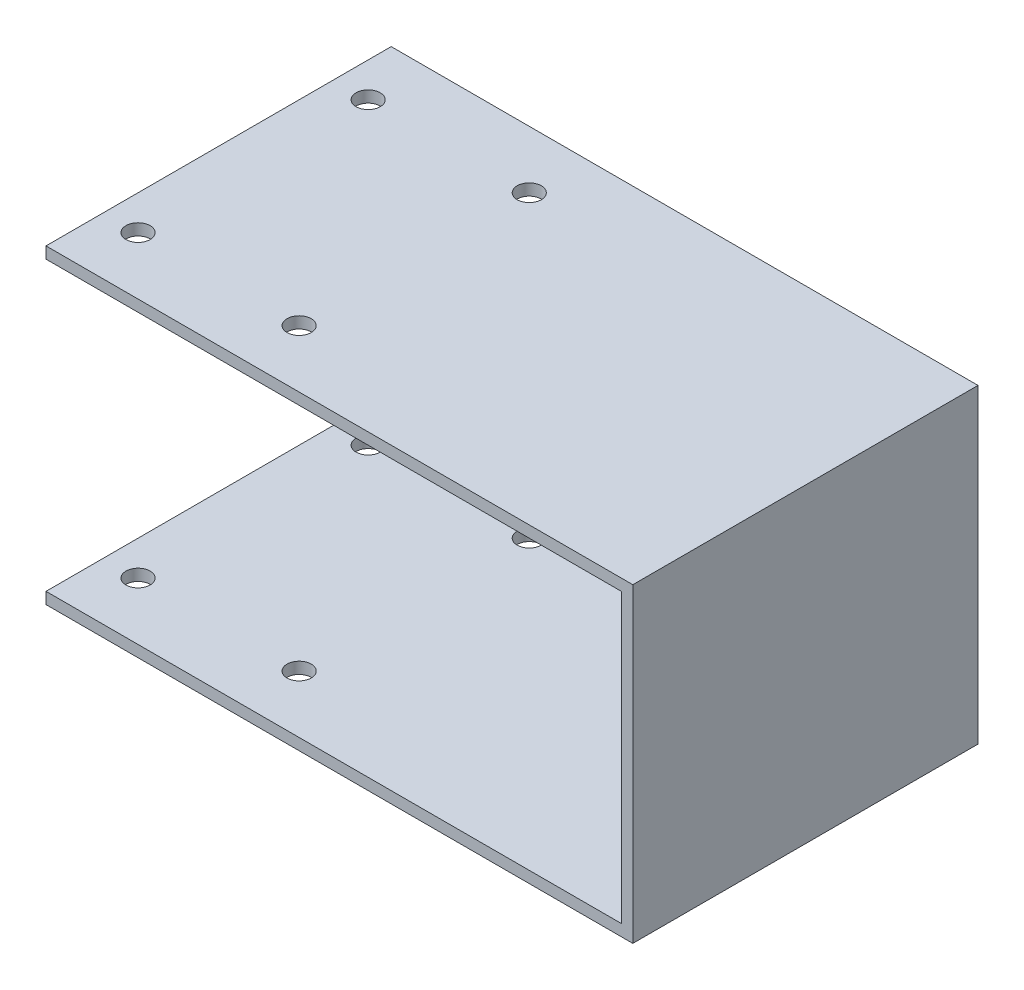
ISO-10303-21;
HEADER;
FILE_DESCRIPTION(('STEP AP214'),'2;1');
FILE_NAME('part.step','',(''),(''),'','','');
FILE_SCHEMA(('AUTOMOTIVE_DESIGN { 1 0 10303 214 1 1 1 1 }'));
ENDSEC;
DATA;
#1=APPLICATION_CONTEXT('core data for automotive mechanical design processes');
#2=APPLICATION_PROTOCOL_DEFINITION('international standard','automotive_design',2000,#1);
#3=PRODUCT_CONTEXT('',#1,'mechanical');
#4=PRODUCT('Part','Part','',(#3));
#5=PRODUCT_RELATED_PRODUCT_CATEGORY('part','',(#4));
#6=PRODUCT_DEFINITION_FORMATION('','',#4);
#7=PRODUCT_DEFINITION_CONTEXT('part definition',#1,'design');
#8=PRODUCT_DEFINITION('design','',#6,#7);
#9=PRODUCT_DEFINITION_SHAPE('','',#8);
#10=(LENGTH_UNIT() NAMED_UNIT(*) SI_UNIT(.MILLI.,.METRE.));
#11=(NAMED_UNIT(*) PLANE_ANGLE_UNIT() SI_UNIT($,.RADIAN.));
#12=(NAMED_UNIT(*) SI_UNIT($,.STERADIAN.) SOLID_ANGLE_UNIT());
#13=UNCERTAINTY_MEASURE_WITH_UNIT(LENGTH_MEASURE(1.E-05),#10,'distance_accuracy_value','');
#14=(GEOMETRIC_REPRESENTATION_CONTEXT(3) GLOBAL_UNCERTAINTY_ASSIGNED_CONTEXT((#13)) GLOBAL_UNIT_ASSIGNED_CONTEXT((#10,
#11,#12)) REPRESENTATION_CONTEXT('',''));
#15=CARTESIAN_POINT('',(0.,0.,0.));
#16=DIRECTION('',(0.,0.,1.));
#17=DIRECTION('',(1.,0.,0.));
#18=AXIS2_PLACEMENT_3D('',#15,#16,#17);
#19=CARTESIAN_POINT('',(0.,-52.,60.));
#20=DIRECTION('',(-1.,0.,0.));
#21=DIRECTION('',(0.,0.,1.));
#22=AXIS2_PLACEMENT_3D('',#19,#20,#21);
#23=PLANE('',#22);
#24=DIRECTION('',(0.,1.,0.));
#25=VECTOR('',#24,1.);
#26=CARTESIAN_POINT('',(0.,-52.,0.));
#27=LINE('',#26,#25);
#28=CARTESIAN_POINT('',(0.,-52.,0.));
#29=VERTEX_POINT('',#28);
#30=CARTESIAN_POINT('',(0.,-50.,0.));
#31=VERTEX_POINT('',#30);
#32=EDGE_CURVE('E141',#29,#31,#27,.T.);
#33=ORIENTED_EDGE('',*,*,#32,.F.);
#34=DIRECTION('',(0.,0.,-1.));
#35=VECTOR('',#34,1.);
#36=CARTESIAN_POINT('',(0.,-52.,60.));
#37=LINE('',#36,#35);
#38=CARTESIAN_POINT('',(0.,-52.,60.));
#39=VERTEX_POINT('',#38);
#40=EDGE_CURVE('E11',#39,#29,#37,.T.);
#41=ORIENTED_EDGE('',*,*,#40,.F.);
#42=DIRECTION('',(0.,1.,0.));
#43=VECTOR('',#42,1.);
#44=CARTESIAN_POINT('',(0.,-52.,60.));
#45=LINE('',#44,#43);
#46=CARTESIAN_POINT('',(0.,-50.,60.));
#47=VERTEX_POINT('',#46);
#48=EDGE_CURVE('E162',#39,#47,#45,.T.);
#49=ORIENTED_EDGE('',*,*,#48,.T.);
#50=DIRECTION('',(0.,0.,-1.));
#51=VECTOR('',#50,1.);
#52=CARTESIAN_POINT('',(0.,-50.,60.));
#53=LINE('',#52,#51);
#54=EDGE_CURVE('E99',#47,#31,#53,.T.);
#55=ORIENTED_EDGE('',*,*,#54,.T.);
#56=EDGE_LOOP('',(#33,#41,#49,#55));
#57=FACE_BOUND('',#56,.T.);
#58=ADVANCED_FACE('F43',(#57),#23,.T.);
#59=CARTESIAN_POINT('',(102.,-52.,60.));
#60=DIRECTION('',(0.,-1.,0.));
#61=DIRECTION('',(1.,0.,0.));
#62=AXIS2_PLACEMENT_3D('',#59,#60,#61);
#63=PLANE('',#62);
#64=CARTESIAN_POINT('',(6.00000000000001,-52.,50.));
#65=DIRECTION('',(0.,1.,0.));
#66=DIRECTION('',(0.,0.,1.));
#67=AXIS2_PLACEMENT_3D('',#64,#65,#66);
#68=CIRCLE('',#67,2.1);
#69=CARTESIAN_POINT('',(6.00000000000001,-52.,52.1));
#70=VERTEX_POINT('',#69);
#71=EDGE_CURVE('E267',#70,#70,#68,.T.);
#72=ORIENTED_EDGE('',*,*,#71,.T.);
#73=EDGE_LOOP('',(#72));
#74=FACE_BOUND('',#73,.T.);
#75=CARTESIAN_POINT('',(34.,-52.,50.));
#76=DIRECTION('',(0.,1.,0.));
#77=DIRECTION('',(0.,0.,1.));
#78=AXIS2_PLACEMENT_3D('',#75,#76,#77);
#79=CIRCLE('',#78,2.1);
#80=CARTESIAN_POINT('',(34.,-52.,52.1));
#81=VERTEX_POINT('',#80);
#82=EDGE_CURVE('E273',#81,#81,#79,.T.);
#83=ORIENTED_EDGE('',*,*,#82,.T.);
#84=EDGE_LOOP('',(#83));
#85=FACE_BOUND('',#84,.T.);
#86=CARTESIAN_POINT('',(34.,-52.,10.));
#87=DIRECTION('',(0.,1.,0.));
#88=DIRECTION('',(0.,0.,1.));
#89=AXIS2_PLACEMENT_3D('',#86,#87,#88);
#90=CIRCLE('',#89,2.1);
#91=CARTESIAN_POINT('',(34.,-52.,12.1));
#92=VERTEX_POINT('',#91);
#93=EDGE_CURVE('E260',#92,#92,#90,.T.);
#94=ORIENTED_EDGE('',*,*,#93,.T.);
#95=EDGE_LOOP('',(#94));
#96=FACE_BOUND('',#95,.T.);
#97=CARTESIAN_POINT('',(6.,-52.,9.99999999999999));
#98=DIRECTION('',(0.,1.,0.));
#99=DIRECTION('',(0.,0.,1.));
#100=AXIS2_PLACEMENT_3D('',#97,#98,#99);
#101=CIRCLE('',#100,2.1);
#102=CARTESIAN_POINT('',(6.,-52.,12.1));
#103=VERTEX_POINT('',#102);
#104=EDGE_CURVE('E258',#103,#103,#101,.T.);
#105=ORIENTED_EDGE('',*,*,#104,.T.);
#106=EDGE_LOOP('',(#105));
#107=FACE_BOUND('',#106,.T.);
#108=DIRECTION('',(-1.,0.,0.));
#109=VECTOR('',#108,1.);
#110=CARTESIAN_POINT('',(102.,-52.,0.));
#111=LINE('',#110,#109);
#112=CARTESIAN_POINT('',(102.,-52.,0.));
#113=VERTEX_POINT('',#112);
#114=EDGE_CURVE('E160',#113,#29,#111,.T.);
#115=ORIENTED_EDGE('',*,*,#114,.F.);
#116=DIRECTION('',(0.,0.,-1.));
#117=VECTOR('',#116,1.);
#118=CARTESIAN_POINT('',(102.,-52.,60.));
#119=LINE('',#118,#117);
#120=CARTESIAN_POINT('',(102.,-52.,60.));
#121=VERTEX_POINT('',#120);
#122=EDGE_CURVE('E52',#121,#113,#119,.T.);
#123=ORIENTED_EDGE('',*,*,#122,.F.);
#124=DIRECTION('',(-1.,0.,0.));
#125=VECTOR('',#124,1.);
#126=CARTESIAN_POINT('',(102.,-52.,60.));
#127=LINE('',#126,#125);
#128=EDGE_CURVE('E131',#121,#39,#127,.T.);
#129=ORIENTED_EDGE('',*,*,#128,.T.);
#130=ORIENTED_EDGE('',*,*,#40,.T.);
#131=EDGE_LOOP('',(#115,#123,#129,#130));
#132=FACE_BOUND('',#131,.T.);
#133=ADVANCED_FACE('F215',(#74,#85,#96,#107,#132),#63,.T.);
#134=CARTESIAN_POINT('',(102.,2.,60.));
#135=DIRECTION('',(1.,0.,0.));
#136=DIRECTION('',(0.,0.,-1.));
#137=AXIS2_PLACEMENT_3D('',#134,#135,#136);
#138=PLANE('',#137);
#139=DIRECTION('',(0.,-1.,0.));
#140=VECTOR('',#139,1.);
#141=CARTESIAN_POINT('',(102.,2.,0.));
#142=LINE('',#141,#140);
#143=CARTESIAN_POINT('',(102.,2.,0.));
#144=VERTEX_POINT('',#143);
#145=EDGE_CURVE('E118',#144,#113,#142,.T.);
#146=ORIENTED_EDGE('',*,*,#145,.F.);
#147=DIRECTION('',(0.,0.,-1.));
#148=VECTOR('',#147,1.);
#149=CARTESIAN_POINT('',(102.,2.,60.));
#150=LINE('',#149,#148);
#151=CARTESIAN_POINT('',(102.,2.,60.));
#152=VERTEX_POINT('',#151);
#153=EDGE_CURVE('E113',#152,#144,#150,.T.);
#154=ORIENTED_EDGE('',*,*,#153,.F.);
#155=DIRECTION('',(0.,-1.,0.));
#156=VECTOR('',#155,1.);
#157=CARTESIAN_POINT('',(102.,2.,60.));
#158=LINE('',#157,#156);
#159=EDGE_CURVE('E116',#152,#121,#158,.T.);
#160=ORIENTED_EDGE('',*,*,#159,.T.);
#161=ORIENTED_EDGE('',*,*,#122,.T.);
#162=EDGE_LOOP('',(#146,#154,#160,#161));
#163=FACE_BOUND('',#162,.T.);
#164=ADVANCED_FACE('F115',(#163),#138,.T.);
#165=CARTESIAN_POINT('',(0.,2.,60.));
#166=DIRECTION('',(0.,1.,0.));
#167=DIRECTION('',(0.,0.,1.));
#168=AXIS2_PLACEMENT_3D('',#165,#166,#167);
#169=PLANE('',#168);
#170=CARTESIAN_POINT('',(6.00000000000001,2.,50.));
#171=DIRECTION('',(0.,1.,0.));
#172=DIRECTION('',(0.,0.,1.));
#173=AXIS2_PLACEMENT_3D('',#170,#171,#172);
#174=CIRCLE('',#173,2.1);
#175=CARTESIAN_POINT('',(6.00000000000001,2.,52.1));
#176=VERTEX_POINT('',#175);
#177=EDGE_CURVE('E270',#176,#176,#174,.T.);
#178=ORIENTED_EDGE('',*,*,#177,.F.);
#179=EDGE_LOOP('',(#178));
#180=FACE_BOUND('',#179,.T.);
#181=CARTESIAN_POINT('',(34.,2.,50.));
#182=DIRECTION('',(0.,1.,0.));
#183=DIRECTION('',(0.,0.,1.));
#184=AXIS2_PLACEMENT_3D('',#181,#182,#183);
#185=CIRCLE('',#184,2.1);
#186=CARTESIAN_POINT('',(34.,2.,52.1));
#187=VERTEX_POINT('',#186);
#188=EDGE_CURVE('E269',#187,#187,#185,.T.);
#189=ORIENTED_EDGE('',*,*,#188,.F.);
#190=EDGE_LOOP('',(#189));
#191=FACE_BOUND('',#190,.T.);
#192=CARTESIAN_POINT('',(34.,2.,10.));
#193=DIRECTION('',(0.,1.,0.));
#194=DIRECTION('',(0.,0.,1.));
#195=AXIS2_PLACEMENT_3D('',#192,#193,#194);
#196=CIRCLE('',#195,2.1);
#197=CARTESIAN_POINT('',(34.,2.,12.1));
#198=VERTEX_POINT('',#197);
#199=EDGE_CURVE('E264',#198,#198,#196,.T.);
#200=ORIENTED_EDGE('',*,*,#199,.F.);
#201=EDGE_LOOP('',(#200));
#202=FACE_BOUND('',#201,.T.);
#203=CARTESIAN_POINT('',(6.,2.,9.99999999999999));
#204=DIRECTION('',(0.,1.,0.));
#205=DIRECTION('',(0.,0.,1.));
#206=AXIS2_PLACEMENT_3D('',#203,#204,#205);
#207=CIRCLE('',#206,2.1);
#208=CARTESIAN_POINT('',(6.,2.,12.1));
#209=VERTEX_POINT('',#208);
#210=EDGE_CURVE('E177',#209,#209,#207,.T.);
#211=ORIENTED_EDGE('',*,*,#210,.F.);
#212=EDGE_LOOP('',(#211));
#213=FACE_BOUND('',#212,.T.);
#214=DIRECTION('',(1.,0.,0.));
#215=VECTOR('',#214,1.);
#216=CARTESIAN_POINT('',(0.,2.,0.));
#217=LINE('',#216,#215);
#218=CARTESIAN_POINT('',(0.,2.,0.));
#219=VERTEX_POINT('',#218);
#220=EDGE_CURVE('E157',#219,#144,#217,.T.);
#221=ORIENTED_EDGE('',*,*,#220,.F.);
#222=DIRECTION('',(0.,0.,-1.));
#223=VECTOR('',#222,1.);
#224=CARTESIAN_POINT('',(0.,2.,60.));
#225=LINE('',#224,#223);
#226=CARTESIAN_POINT('',(0.,2.,60.));
#227=VERTEX_POINT('',#226);
#228=EDGE_CURVE('E123',#227,#219,#225,.T.);
#229=ORIENTED_EDGE('',*,*,#228,.F.);
#230=DIRECTION('',(1.,0.,0.));
#231=VECTOR('',#230,1.);
#232=CARTESIAN_POINT('',(0.,2.,60.));
#233=LINE('',#232,#231);
#234=EDGE_CURVE('E129',#227,#152,#233,.T.);
#235=ORIENTED_EDGE('',*,*,#234,.T.);
#236=ORIENTED_EDGE('',*,*,#153,.T.);
#237=EDGE_LOOP('',(#221,#229,#235,#236));
#238=FACE_BOUND('',#237,.T.);
#239=ADVANCED_FACE('F133',(#180,#191,#202,#213,#238),#169,.T.);
#240=CARTESIAN_POINT('',(0.,0.,60.));
#241=DIRECTION('',(-1.,0.,0.));
#242=DIRECTION('',(0.,0.,1.));
#243=AXIS2_PLACEMENT_3D('',#240,#241,#242);
#244=PLANE('',#243);
#245=DIRECTION('',(0.,1.,0.));
#246=VECTOR('',#245,1.);
#247=CARTESIAN_POINT('',(0.,0.,0.));
#248=LINE('',#247,#246);
#249=CARTESIAN_POINT('',(0.,0.,0.));
#250=VERTEX_POINT('',#249);
#251=EDGE_CURVE('E154',#250,#219,#248,.T.);
#252=ORIENTED_EDGE('',*,*,#251,.F.);
#253=DIRECTION('',(0.,0.,-1.));
#254=VECTOR('',#253,1.);
#255=CARTESIAN_POINT('',(0.,0.,60.));
#256=LINE('',#255,#254);
#257=CARTESIAN_POINT('',(0.,0.,60.));
#258=VERTEX_POINT('',#257);
#259=EDGE_CURVE('E166',#258,#250,#256,.T.);
#260=ORIENTED_EDGE('',*,*,#259,.F.);
#261=DIRECTION('',(0.,1.,0.));
#262=VECTOR('',#261,1.);
#263=CARTESIAN_POINT('',(0.,0.,60.));
#264=LINE('',#263,#262);
#265=EDGE_CURVE('E134',#258,#227,#264,.T.);
#266=ORIENTED_EDGE('',*,*,#265,.T.);
#267=ORIENTED_EDGE('',*,*,#228,.T.);
#268=EDGE_LOOP('',(#252,#260,#266,#267));
#269=FACE_BOUND('',#268,.T.);
#270=ADVANCED_FACE('F230',(#269),#244,.T.);
#271=CARTESIAN_POINT('',(100.,0.,60.));
#272=DIRECTION('',(0.,-1.,0.));
#273=DIRECTION('',(1.,0.,0.));
#274=AXIS2_PLACEMENT_3D('',#271,#272,#273);
#275=PLANE('',#274);
#276=CARTESIAN_POINT('',(6.00000000000001,0.,50.));
#277=DIRECTION('',(0.,-1.,0.));
#278=DIRECTION('',(1.,0.,0.));
#279=AXIS2_PLACEMENT_3D('',#276,#277,#278);
#280=CIRCLE('',#279,2.1);
#281=CARTESIAN_POINT('',(8.1,0.,50.));
#282=VERTEX_POINT('',#281);
#283=EDGE_CURVE('E145',#282,#282,#280,.F.);
#284=ORIENTED_EDGE('',*,*,#283,.T.);
#285=EDGE_LOOP('',(#284));
#286=FACE_BOUND('',#285,.T.);
#287=CARTESIAN_POINT('',(34.,0.,50.));
#288=DIRECTION('',(0.,-1.,0.));
#289=DIRECTION('',(1.,0.,0.));
#290=AXIS2_PLACEMENT_3D('',#287,#288,#289);
#291=CIRCLE('',#290,2.1);
#292=CARTESIAN_POINT('',(36.1,0.,50.));
#293=VERTEX_POINT('',#292);
#294=EDGE_CURVE('E183',#293,#293,#291,.F.);
#295=ORIENTED_EDGE('',*,*,#294,.T.);
#296=EDGE_LOOP('',(#295));
#297=FACE_BOUND('',#296,.T.);
#298=CARTESIAN_POINT('',(34.,0.,10.));
#299=DIRECTION('',(0.,-1.,0.));
#300=DIRECTION('',(1.,0.,0.));
#301=AXIS2_PLACEMENT_3D('',#298,#299,#300);
#302=CIRCLE('',#301,2.1);
#303=CARTESIAN_POINT('',(36.1,0.,10.));
#304=VERTEX_POINT('',#303);
#305=EDGE_CURVE('E180',#304,#304,#302,.F.);
#306=ORIENTED_EDGE('',*,*,#305,.T.);
#307=EDGE_LOOP('',(#306));
#308=FACE_BOUND('',#307,.T.);
#309=CARTESIAN_POINT('',(6.,0.,9.99999999999999));
#310=DIRECTION('',(0.,-1.,0.));
#311=DIRECTION('',(1.,0.,0.));
#312=AXIS2_PLACEMENT_3D('',#309,#310,#311);
#313=CIRCLE('',#312,2.1);
#314=CARTESIAN_POINT('',(8.1,0.,9.99999999999999));
#315=VERTEX_POINT('',#314);
#316=EDGE_CURVE('E176',#315,#315,#313,.F.);
#317=ORIENTED_EDGE('',*,*,#316,.T.);
#318=EDGE_LOOP('',(#317));
#319=FACE_BOUND('',#318,.T.);
#320=DIRECTION('',(-1.,0.,0.));
#321=VECTOR('',#320,1.);
#322=CARTESIAN_POINT('',(100.,0.,0.));
#323=LINE('',#322,#321);
#324=CARTESIAN_POINT('',(100.,0.,0.));
#325=VERTEX_POINT('',#324);
#326=EDGE_CURVE('E151',#325,#250,#323,.T.);
#327=ORIENTED_EDGE('',*,*,#326,.F.);
#328=DIRECTION('',(0.,0.,-1.));
#329=VECTOR('',#328,1.);
#330=CARTESIAN_POINT('',(100.,0.,60.));
#331=LINE('',#330,#329);
#332=CARTESIAN_POINT('',(100.,0.,60.));
#333=VERTEX_POINT('',#332);
#334=EDGE_CURVE('E168',#333,#325,#331,.T.);
#335=ORIENTED_EDGE('',*,*,#334,.F.);
#336=DIRECTION('',(-1.,0.,0.));
#337=VECTOR('',#336,1.);
#338=CARTESIAN_POINT('',(100.,0.,60.));
#339=LINE('',#338,#337);
#340=EDGE_CURVE('E136',#333,#258,#339,.T.);
#341=ORIENTED_EDGE('',*,*,#340,.T.);
#342=ORIENTED_EDGE('',*,*,#259,.T.);
#343=EDGE_LOOP('',(#327,#335,#341,#342));
#344=FACE_BOUND('',#343,.T.);
#345=ADVANCED_FACE('F206',(#286,#297,#308,#319,#344),#275,.T.);
#346=CARTESIAN_POINT('',(100.,-50.,60.));
#347=DIRECTION('',(-1.,0.,0.));
#348=DIRECTION('',(0.,0.,1.));
#349=AXIS2_PLACEMENT_3D('',#346,#347,#348);
#350=PLANE('',#349);
#351=DIRECTION('',(0.,1.,0.));
#352=VECTOR('',#351,1.);
#353=CARTESIAN_POINT('',(100.,-50.,0.));
#354=LINE('',#353,#352);
#355=CARTESIAN_POINT('',(100.,-50.,0.));
#356=VERTEX_POINT('',#355);
#357=EDGE_CURVE('E148',#356,#325,#354,.T.);
#358=ORIENTED_EDGE('',*,*,#357,.F.);
#359=DIRECTION('',(0.,0.,-1.));
#360=VECTOR('',#359,1.);
#361=CARTESIAN_POINT('',(100.,-50.,60.));
#362=LINE('',#361,#360);
#363=CARTESIAN_POINT('',(100.,-50.,60.));
#364=VERTEX_POINT('',#363);
#365=EDGE_CURVE('E170',#364,#356,#362,.T.);
#366=ORIENTED_EDGE('',*,*,#365,.F.);
#367=DIRECTION('',(0.,1.,0.));
#368=VECTOR('',#367,1.);
#369=CARTESIAN_POINT('',(100.,-50.,60.));
#370=LINE('',#369,#368);
#371=EDGE_CURVE('E200',#364,#333,#370,.T.);
#372=ORIENTED_EDGE('',*,*,#371,.T.);
#373=ORIENTED_EDGE('',*,*,#334,.T.);
#374=EDGE_LOOP('',(#358,#366,#372,#373));
#375=FACE_BOUND('',#374,.T.);
#376=ADVANCED_FACE('F211',(#375),#350,.T.);
#377=CARTESIAN_POINT('',(0.,-50.,60.));
#378=DIRECTION('',(0.,1.,0.));
#379=DIRECTION('',(0.,0.,1.));
#380=AXIS2_PLACEMENT_3D('',#377,#378,#379);
#381=PLANE('',#380);
#382=CARTESIAN_POINT('',(6.00000000000001,-50.,50.));
#383=DIRECTION('',(0.,1.,0.));
#384=DIRECTION('',(0.,0.,1.));
#385=AXIS2_PLACEMENT_3D('',#382,#383,#384);
#386=CIRCLE('',#385,2.1);
#387=CARTESIAN_POINT('',(6.00000000000001,-50.,52.1));
#388=VERTEX_POINT('',#387);
#389=EDGE_CURVE('E46',#388,#388,#386,.F.);
#390=ORIENTED_EDGE('',*,*,#389,.T.);
#391=EDGE_LOOP('',(#390));
#392=FACE_BOUND('',#391,.T.);
#393=CARTESIAN_POINT('',(34.,-50.,50.));
#394=DIRECTION('',(0.,1.,0.));
#395=DIRECTION('',(0.,0.,1.));
#396=AXIS2_PLACEMENT_3D('',#393,#394,#395);
#397=CIRCLE('',#396,2.1);
#398=CARTESIAN_POINT('',(34.,-50.,52.1));
#399=VERTEX_POINT('',#398);
#400=EDGE_CURVE('E181',#399,#399,#397,.F.);
#401=ORIENTED_EDGE('',*,*,#400,.T.);
#402=EDGE_LOOP('',(#401));
#403=FACE_BOUND('',#402,.T.);
#404=CARTESIAN_POINT('',(34.,-50.,10.));
#405=DIRECTION('',(0.,1.,0.));
#406=DIRECTION('',(0.,0.,1.));
#407=AXIS2_PLACEMENT_3D('',#404,#405,#406);
#408=CIRCLE('',#407,2.1);
#409=CARTESIAN_POINT('',(34.,-50.,12.1));
#410=VERTEX_POINT('',#409);
#411=EDGE_CURVE('E178',#410,#410,#408,.F.);
#412=ORIENTED_EDGE('',*,*,#411,.T.);
#413=EDGE_LOOP('',(#412));
#414=FACE_BOUND('',#413,.T.);
#415=CARTESIAN_POINT('',(6.,-50.,9.99999999999999));
#416=DIRECTION('',(0.,1.,0.));
#417=DIRECTION('',(0.,0.,1.));
#418=AXIS2_PLACEMENT_3D('',#415,#416,#417);
#419=CIRCLE('',#418,2.1);
#420=CARTESIAN_POINT('',(6.,-50.,12.1));
#421=VERTEX_POINT('',#420);
#422=EDGE_CURVE('E173',#421,#421,#419,.F.);
#423=ORIENTED_EDGE('',*,*,#422,.T.);
#424=EDGE_LOOP('',(#423));
#425=FACE_BOUND('',#424,.T.);
#426=DIRECTION('',(1.,0.,0.));
#427=VECTOR('',#426,1.);
#428=CARTESIAN_POINT('',(0.,-50.,0.));
#429=LINE('',#428,#427);
#430=EDGE_CURVE('E144',#31,#356,#429,.T.);
#431=ORIENTED_EDGE('',*,*,#430,.F.);
#432=ORIENTED_EDGE('',*,*,#54,.F.);
#433=DIRECTION('',(1.,0.,0.));
#434=VECTOR('',#433,1.);
#435=CARTESIAN_POINT('',(0.,-50.,60.));
#436=LINE('',#435,#434);
#437=EDGE_CURVE('E198',#47,#364,#436,.T.);
#438=ORIENTED_EDGE('',*,*,#437,.T.);
#439=ORIENTED_EDGE('',*,*,#365,.T.);
#440=EDGE_LOOP('',(#431,#432,#438,#439));
#441=FACE_BOUND('',#440,.T.);
#442=ADVANCED_FACE('F212',(#392,#403,#414,#425,#441),#381,.T.);
#443=CARTESIAN_POINT('',(0.,0.,60.));
#444=DIRECTION('',(0.,0.,-1.));
#445=DIRECTION('',(-1.,0.,0.));
#446=AXIS2_PLACEMENT_3D('',#443,#444,#445);
#447=PLANE('',#446);
#448=ORIENTED_EDGE('',*,*,#48,.F.);
#449=ORIENTED_EDGE('',*,*,#128,.F.);
#450=ORIENTED_EDGE('',*,*,#159,.F.);
#451=ORIENTED_EDGE('',*,*,#234,.F.);
#452=ORIENTED_EDGE('',*,*,#265,.F.);
#453=ORIENTED_EDGE('',*,*,#340,.F.);
#454=ORIENTED_EDGE('',*,*,#371,.F.);
#455=ORIENTED_EDGE('',*,*,#437,.F.);
#456=EDGE_LOOP('',(#448,#449,#450,#451,#452,#453,#454,#455));
#457=FACE_BOUND('',#456,.T.);
#458=ADVANCED_FACE('F127',(#457),#447,.F.);
#459=CARTESIAN_POINT('',(0.,0.,0.));
#460=DIRECTION('',(0.,0.,-1.));
#461=DIRECTION('',(-1.,0.,0.));
#462=AXIS2_PLACEMENT_3D('',#459,#460,#461);
#463=PLANE('',#462);
#464=ORIENTED_EDGE('',*,*,#32,.T.);
#465=ORIENTED_EDGE('',*,*,#430,.T.);
#466=ORIENTED_EDGE('',*,*,#357,.T.);
#467=ORIENTED_EDGE('',*,*,#326,.T.);
#468=ORIENTED_EDGE('',*,*,#251,.T.);
#469=ORIENTED_EDGE('',*,*,#220,.T.);
#470=ORIENTED_EDGE('',*,*,#145,.T.);
#471=ORIENTED_EDGE('',*,*,#114,.T.);
#472=EDGE_LOOP('',(#464,#465,#466,#467,#468,#469,#470,#471));
#473=FACE_BOUND('',#472,.T.);
#474=ADVANCED_FACE('F214',(#473),#463,.T.);
#475=CARTESIAN_POINT('',(6.,2.,9.99999999999999));
#476=DIRECTION('',(0.,-1.,0.));
#477=DIRECTION('',(0.,0.,-1.));
#478=AXIS2_PLACEMENT_3D('',#475,#476,#477);
#479=CYLINDRICAL_SURFACE('',#478,2.1);
#480=ORIENTED_EDGE('',*,*,#422,.F.);
#481=EDGE_LOOP('',(#480));
#482=FACE_BOUND('',#481,.T.);
#483=ORIENTED_EDGE('',*,*,#104,.F.);
#484=EDGE_LOOP('',(#483));
#485=FACE_BOUND('',#484,.T.);
#486=ADVANCED_FACE('F250',(#482,#485),#479,.F.);
#487=CARTESIAN_POINT('',(34.,2.,10.));
#488=DIRECTION('',(0.,-1.,0.));
#489=DIRECTION('',(0.,0.,-1.));
#490=AXIS2_PLACEMENT_3D('',#487,#488,#489);
#491=CYLINDRICAL_SURFACE('',#490,2.1);
#492=ORIENTED_EDGE('',*,*,#411,.F.);
#493=EDGE_LOOP('',(#492));
#494=FACE_BOUND('',#493,.T.);
#495=ORIENTED_EDGE('',*,*,#93,.F.);
#496=EDGE_LOOP('',(#495));
#497=FACE_BOUND('',#496,.T.);
#498=ADVANCED_FACE('F253',(#494,#497),#491,.F.);
#499=CARTESIAN_POINT('',(34.,2.,50.));
#500=DIRECTION('',(0.,-1.,0.));
#501=DIRECTION('',(0.,0.,-1.));
#502=AXIS2_PLACEMENT_3D('',#499,#500,#501);
#503=CYLINDRICAL_SURFACE('',#502,2.1);
#504=ORIENTED_EDGE('',*,*,#400,.F.);
#505=EDGE_LOOP('',(#504));
#506=FACE_BOUND('',#505,.T.);
#507=ORIENTED_EDGE('',*,*,#82,.F.);
#508=EDGE_LOOP('',(#507));
#509=FACE_BOUND('',#508,.T.);
#510=ADVANCED_FACE('F296',(#506,#509),#503,.F.);
#511=CARTESIAN_POINT('',(6.00000000000001,2.,50.));
#512=DIRECTION('',(0.,-1.,0.));
#513=DIRECTION('',(0.,0.,-1.));
#514=AXIS2_PLACEMENT_3D('',#511,#512,#513);
#515=CYLINDRICAL_SURFACE('',#514,2.1);
#516=ORIENTED_EDGE('',*,*,#389,.F.);
#517=EDGE_LOOP('',(#516));
#518=FACE_BOUND('',#517,.T.);
#519=ORIENTED_EDGE('',*,*,#71,.F.);
#520=EDGE_LOOP('',(#519));
#521=FACE_BOUND('',#520,.T.);
#522=ADVANCED_FACE('F287',(#518,#521),#515,.F.);
#523=ORIENTED_EDGE('',*,*,#316,.F.);
#524=EDGE_LOOP('',(#523));
#525=FACE_BOUND('',#524,.T.);
#526=ORIENTED_EDGE('',*,*,#210,.T.);
#527=EDGE_LOOP('',(#526));
#528=FACE_BOUND('',#527,.T.);
#529=ADVANCED_FACE('F255',(#525,#528),#479,.F.);
#530=ORIENTED_EDGE('',*,*,#305,.F.);
#531=EDGE_LOOP('',(#530));
#532=FACE_BOUND('',#531,.T.);
#533=ORIENTED_EDGE('',*,*,#199,.T.);
#534=EDGE_LOOP('',(#533));
#535=FACE_BOUND('',#534,.T.);
#536=ADVANCED_FACE('F281',(#532,#535),#491,.F.);
#537=ORIENTED_EDGE('',*,*,#294,.F.);
#538=EDGE_LOOP('',(#537));
#539=FACE_BOUND('',#538,.T.);
#540=ORIENTED_EDGE('',*,*,#188,.T.);
#541=EDGE_LOOP('',(#540));
#542=FACE_BOUND('',#541,.T.);
#543=ADVANCED_FACE('F293',(#539,#542),#503,.F.);
#544=ORIENTED_EDGE('',*,*,#283,.F.);
#545=EDGE_LOOP('',(#544));
#546=FACE_BOUND('',#545,.T.);
#547=ORIENTED_EDGE('',*,*,#177,.T.);
#548=EDGE_LOOP('',(#547));
#549=FACE_BOUND('',#548,.T.);
#550=ADVANCED_FACE('F299',(#546,#549),#515,.F.);
#551=CLOSED_SHELL('',(#58,#133,#164,#239,#270,#345,#376,#442,#458,#474,#486,#498,#510,#522,#529,
#536,#543,#550));
#552=MANIFOLD_SOLID_BREP('B2',#551);
#553=ADVANCED_BREP_SHAPE_REPRESENTATION('',(#18,#552),#14);
#554=SHAPE_DEFINITION_REPRESENTATION(#9,#553);
ENDSEC;
END-ISO-10303-21;
